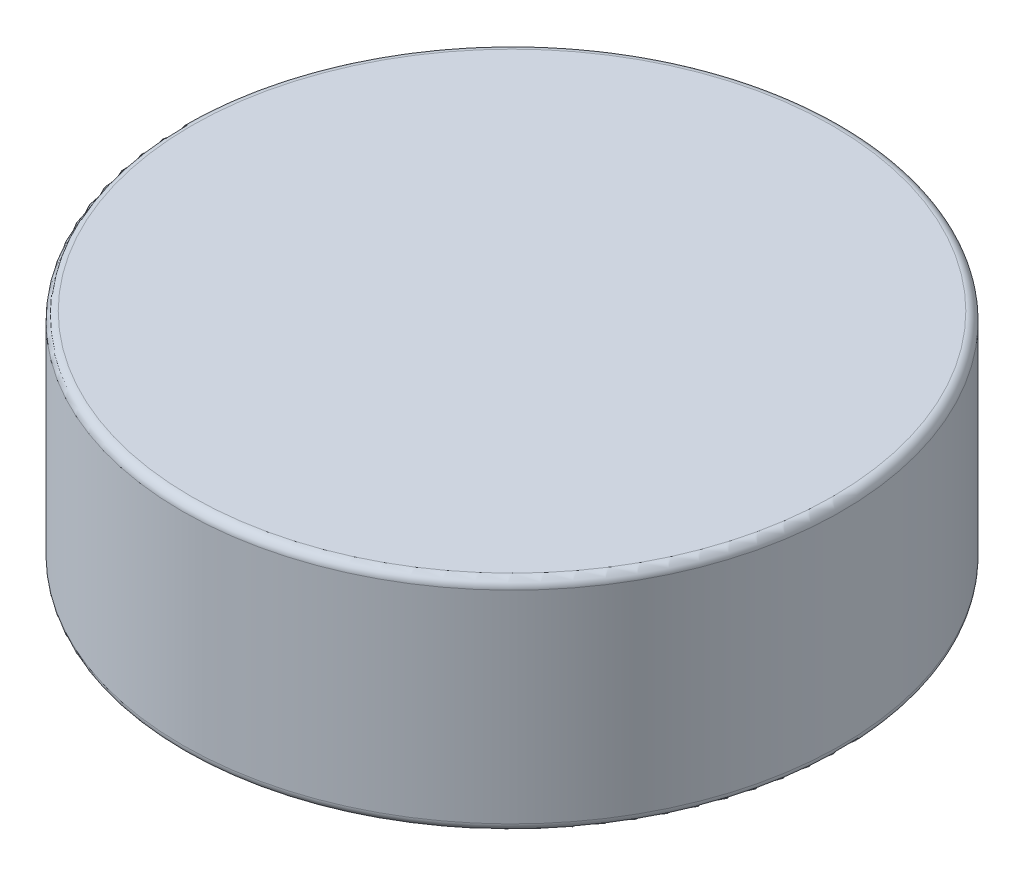
ISO-10303-21;
HEADER;
FILE_DESCRIPTION(('STEP AP214'),'2;1');
FILE_NAME('part.step','',(''),(''),'','','');
FILE_SCHEMA(('AUTOMOTIVE_DESIGN { 1 0 10303 214 1 1 1 1 }'));
ENDSEC;
DATA;
#1=APPLICATION_CONTEXT('core data for automotive mechanical design processes');
#2=APPLICATION_PROTOCOL_DEFINITION('international standard','automotive_design',2000,#1);
#3=PRODUCT_CONTEXT('',#1,'mechanical');
#4=PRODUCT('Part','Part','',(#3));
#5=PRODUCT_RELATED_PRODUCT_CATEGORY('part','',(#4));
#6=PRODUCT_DEFINITION_FORMATION('','',#4);
#7=PRODUCT_DEFINITION_CONTEXT('part definition',#1,'design');
#8=PRODUCT_DEFINITION('design','',#6,#7);
#9=PRODUCT_DEFINITION_SHAPE('','',#8);
#10=(LENGTH_UNIT() NAMED_UNIT(*) SI_UNIT(.MILLI.,.METRE.));
#11=(NAMED_UNIT(*) PLANE_ANGLE_UNIT() SI_UNIT($,.RADIAN.));
#12=(NAMED_UNIT(*) SI_UNIT($,.STERADIAN.) SOLID_ANGLE_UNIT());
#13=UNCERTAINTY_MEASURE_WITH_UNIT(LENGTH_MEASURE(1.E-05),#10,'distance_accuracy_value','');
#14=(GEOMETRIC_REPRESENTATION_CONTEXT(3) GLOBAL_UNCERTAINTY_ASSIGNED_CONTEXT((#13)) GLOBAL_UNIT_ASSIGNED_CONTEXT((#10,
#11,#12)) REPRESENTATION_CONTEXT('',''));
#15=CARTESIAN_POINT('',(0.,0.,0.));
#16=DIRECTION('',(0.,0.,1.));
#17=DIRECTION('',(1.,0.,0.));
#18=AXIS2_PLACEMENT_3D('',#15,#16,#17);
#19=CARTESIAN_POINT('',(0.,12.7,0.));
#20=DIRECTION('',(0.,-1.,0.));
#21=DIRECTION('',(0.,0.,-1.));
#22=AXIS2_PLACEMENT_3D('',#19,#20,#21);
#23=CYLINDRICAL_SURFACE('',#22,38.1);
#24=CARTESIAN_POINT('',(0.,-11.7,0.));
#25=DIRECTION('',(0.,1.,0.));
#26=DIRECTION('',(0.,0.,1.));
#27=AXIS2_PLACEMENT_3D('',#24,#25,#26);
#28=CIRCLE('',#27,38.1);
#29=CARTESIAN_POINT('',(0.,-11.7,38.1));
#30=VERTEX_POINT('',#29);
#31=EDGE_CURVE('E44',#30,#30,#28,.T.);
#32=ORIENTED_EDGE('',*,*,#31,.T.);
#33=EDGE_LOOP('',(#32));
#34=FACE_BOUND('',#33,.T.);
#35=CARTESIAN_POINT('',(0.,11.7,0.));
#36=DIRECTION('',(0.,1.,0.));
#37=DIRECTION('',(0.,0.,1.));
#38=AXIS2_PLACEMENT_3D('',#35,#36,#37);
#39=CIRCLE('',#38,38.1);
#40=CARTESIAN_POINT('',(0.,11.7,38.1));
#41=VERTEX_POINT('',#40);
#42=EDGE_CURVE('E48',#41,#41,#39,.F.);
#43=ORIENTED_EDGE('',*,*,#42,.T.);
#44=EDGE_LOOP('',(#43));
#45=FACE_BOUND('',#44,.T.);
#46=ADVANCED_FACE('F33',(#34,#45),#23,.T.);
#47=CARTESIAN_POINT('',(0.,12.7,0.));
#48=DIRECTION('',(0.,1.,0.));
#49=DIRECTION('',(0.,0.,1.));
#50=AXIS2_PLACEMENT_3D('',#47,#48,#49);
#51=PLANE('',#50);
#52=CARTESIAN_POINT('',(0.,12.7,0.));
#53=DIRECTION('',(0.,1.,0.));
#54=DIRECTION('',(0.,0.,1.));
#55=AXIS2_PLACEMENT_3D('',#52,#53,#54);
#56=CIRCLE('',#55,37.1);
#57=CARTESIAN_POINT('',(0.,12.7,37.1));
#58=VERTEX_POINT('',#57);
#59=EDGE_CURVE('E10',#58,#58,#56,.T.);
#60=ORIENTED_EDGE('',*,*,#59,.T.);
#61=EDGE_LOOP('',(#60));
#62=FACE_BOUND('',#61,.T.);
#63=ADVANCED_FACE('F64',(#62),#51,.T.);
#64=CARTESIAN_POINT('',(0.,-12.7,0.));
#65=DIRECTION('',(0.,1.,0.));
#66=DIRECTION('',(0.,0.,1.));
#67=AXIS2_PLACEMENT_3D('',#64,#65,#66);
#68=PLANE('',#67);
#69=CARTESIAN_POINT('',(0.,-12.7,0.));
#70=DIRECTION('',(0.,1.,0.));
#71=DIRECTION('',(0.,0.,1.));
#72=AXIS2_PLACEMENT_3D('',#69,#70,#71);
#73=CIRCLE('',#72,37.1);
#74=CARTESIAN_POINT('',(0.,-12.7,37.1));
#75=VERTEX_POINT('',#74);
#76=EDGE_CURVE('E40',#75,#75,#73,.F.);
#77=ORIENTED_EDGE('',*,*,#76,.T.);
#78=EDGE_LOOP('',(#77));
#79=FACE_BOUND('',#78,.T.);
#80=ADVANCED_FACE('F61',(#79),#68,.F.);
#81=CARTESIAN_POINT('',(0.,-11.7,0.));
#82=DIRECTION('',(0.,1.,0.));
#83=DIRECTION('',(0.,0.,1.));
#84=AXIS2_PLACEMENT_3D('',#81,#82,#83);
#85=TOROIDAL_SURFACE('',#84,37.1,1.);
#86=ORIENTED_EDGE('',*,*,#76,.F.);
#87=EDGE_LOOP('',(#86));
#88=FACE_BOUND('',#87,.T.);
#89=ORIENTED_EDGE('',*,*,#31,.F.);
#90=EDGE_LOOP('',(#89));
#91=FACE_BOUND('',#90,.T.);
#92=ADVANCED_FACE('F57',(#88,#91),#85,.T.);
#93=CARTESIAN_POINT('',(0.,11.7,0.));
#94=DIRECTION('',(0.,1.,0.));
#95=DIRECTION('',(0.,0.,1.));
#96=AXIS2_PLACEMENT_3D('',#93,#94,#95);
#97=TOROIDAL_SURFACE('',#96,37.1,1.);
#98=ORIENTED_EDGE('',*,*,#42,.F.);
#99=EDGE_LOOP('',(#98));
#100=FACE_BOUND('',#99,.T.);
#101=ORIENTED_EDGE('',*,*,#59,.F.);
#102=EDGE_LOOP('',(#101));
#103=FACE_BOUND('',#102,.T.);
#104=ADVANCED_FACE('F35',(#100,#103),#97,.T.);
#105=CLOSED_SHELL('',(#46,#63,#80,#92,#104));
#106=MANIFOLD_SOLID_BREP('B2',#105);
#107=ADVANCED_BREP_SHAPE_REPRESENTATION('',(#18,#106),#14);
#108=SHAPE_DEFINITION_REPRESENTATION(#9,#107);
ENDSEC;
END-ISO-10303-21;
